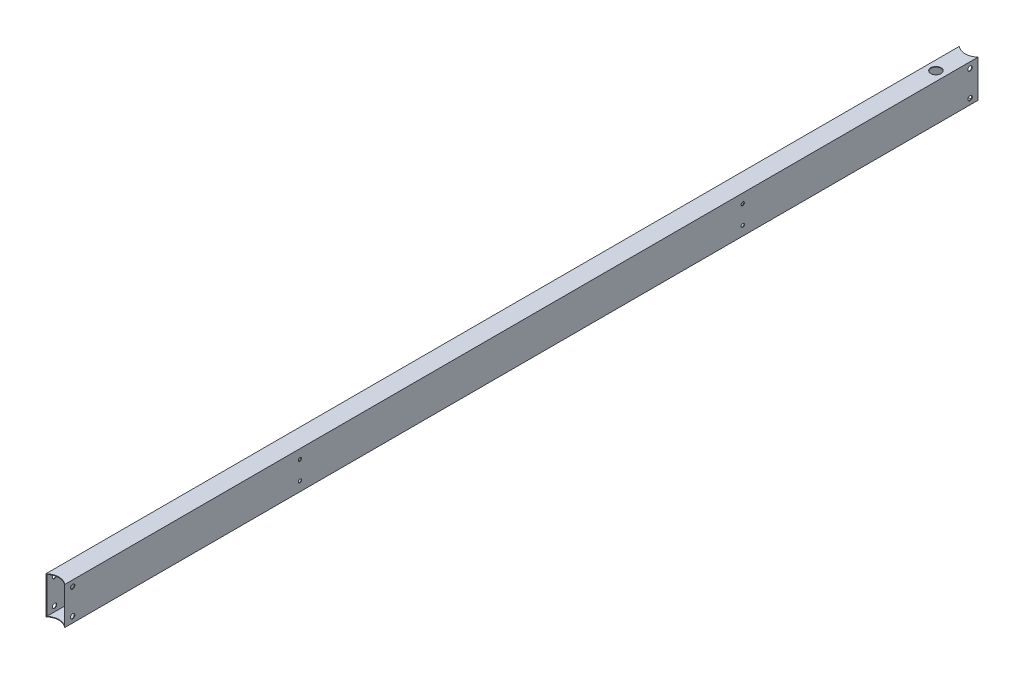
ISO-10303-21;
HEADER;
FILE_DESCRIPTION(('STEP AP214'),'2;1');
FILE_NAME('part.step','',(''),(''),'','','');
FILE_SCHEMA(('AUTOMOTIVE_DESIGN { 1 0 10303 214 1 1 1 1 }'));
ENDSEC;
DATA;
#1=APPLICATION_CONTEXT('core data for automotive mechanical design processes');
#2=APPLICATION_PROTOCOL_DEFINITION('international standard','automotive_design',2000,#1);
#3=PRODUCT_CONTEXT('',#1,'mechanical');
#4=PRODUCT('Part','Part','',(#3));
#5=PRODUCT_RELATED_PRODUCT_CATEGORY('part','',(#4));
#6=PRODUCT_DEFINITION_FORMATION('','',#4);
#7=PRODUCT_DEFINITION_CONTEXT('part definition',#1,'design');
#8=PRODUCT_DEFINITION('design','',#6,#7);
#9=PRODUCT_DEFINITION_SHAPE('','',#8);
#10=(LENGTH_UNIT() NAMED_UNIT(*) SI_UNIT(.MILLI.,.METRE.));
#11=(NAMED_UNIT(*) PLANE_ANGLE_UNIT() SI_UNIT($,.RADIAN.));
#12=(NAMED_UNIT(*) SI_UNIT($,.STERADIAN.) SOLID_ANGLE_UNIT());
#13=UNCERTAINTY_MEASURE_WITH_UNIT(LENGTH_MEASURE(1.E-05),#10,'distance_accuracy_value','');
#14=(GEOMETRIC_REPRESENTATION_CONTEXT(3) GLOBAL_UNCERTAINTY_ASSIGNED_CONTEXT((#13)) GLOBAL_UNIT_ASSIGNED_CONTEXT((#10,
#11,#12)) REPRESENTATION_CONTEXT('',''));
#15=CARTESIAN_POINT('',(0.,0.,0.));
#16=DIRECTION('',(0.,0.,1.));
#17=DIRECTION('',(1.,0.,0.));
#18=AXIS2_PLACEMENT_3D('',#15,#16,#17);
#19=CARTESIAN_POINT('',(0.,0.,1955.));
#20=DIRECTION('',(1.,0.,0.));
#21=DIRECTION('',(0.,0.,-1.));
#22=AXIS2_PLACEMENT_3D('',#19,#20,#21);
#23=PLANE('',#22);
#24=CARTESIAN_POINT('',(0.,19.9999999999997,1451.5));
#25=DIRECTION('',(1.,0.,0.));
#26=DIRECTION('',(0.,0.,-1.));
#27=AXIS2_PLACEMENT_3D('',#24,#25,#26);
#28=CIRCLE('',#27,3.49999999999997);
#29=CARTESIAN_POINT('',(0.,19.9999999999997,1448.));
#30=VERTEX_POINT('',#29);
#31=EDGE_CURVE('E174',#30,#30,#28,.T.);
#32=ORIENTED_EDGE('',*,*,#31,.T.);
#33=EDGE_LOOP('',(#32));
#34=FACE_BOUND('',#33,.T.);
#35=CARTESIAN_POINT('',(0.,59.9999999999998,503.5));
#36=DIRECTION('',(1.,0.,0.));
#37=DIRECTION('',(0.,0.,-1.));
#38=AXIS2_PLACEMENT_3D('',#35,#36,#37);
#39=CIRCLE('',#38,3.49999999999996);
#40=CARTESIAN_POINT('',(0.,59.9999999999998,500.));
#41=VERTEX_POINT('',#40);
#42=EDGE_CURVE('E313',#41,#41,#39,.T.);
#43=ORIENTED_EDGE('',*,*,#42,.T.);
#44=EDGE_LOOP('',(#43));
#45=FACE_BOUND('',#44,.T.);
#46=CARTESIAN_POINT('',(0.,19.9999999999998,503.5));
#47=DIRECTION('',(1.,0.,0.));
#48=DIRECTION('',(0.,0.,-1.));
#49=AXIS2_PLACEMENT_3D('',#46,#47,#48);
#50=CIRCLE('',#49,3.49999999999996);
#51=CARTESIAN_POINT('',(0.,19.9999999999998,500.));
#52=VERTEX_POINT('',#51);
#53=EDGE_CURVE('E317',#52,#52,#50,.T.);
#54=ORIENTED_EDGE('',*,*,#53,.T.);
#55=EDGE_LOOP('',(#54));
#56=FACE_BOUND('',#55,.T.);
#57=CARTESIAN_POINT('',(0.,59.9999999999997,1451.5));
#58=DIRECTION('',(1.,0.,0.));
#59=DIRECTION('',(0.,0.,-1.));
#60=AXIS2_PLACEMENT_3D('',#57,#58,#59);
#61=CIRCLE('',#60,3.49999999999997);
#62=CARTESIAN_POINT('',(0.,59.9999999999997,1448.));
#63=VERTEX_POINT('',#62);
#64=EDGE_CURVE('E170',#63,#63,#61,.T.);
#65=ORIENTED_EDGE('',*,*,#64,.T.);
#66=EDGE_LOOP('',(#65));
#67=FACE_BOUND('',#66,.T.);
#68=CARTESIAN_POINT('',(0.,12.4999999999999,17.));
#69=DIRECTION('',(1.,0.,0.));
#70=DIRECTION('',(0.,0.,-1.));
#71=AXIS2_PLACEMENT_3D('',#68,#69,#70);
#72=CIRCLE('',#71,4.75);
#73=CARTESIAN_POINT('',(0.,12.4999999999999,12.25));
#74=VERTEX_POINT('',#73);
#75=EDGE_CURVE('E157',#74,#74,#72,.T.);
#76=ORIENTED_EDGE('',*,*,#75,.T.);
#77=EDGE_LOOP('',(#76));
#78=FACE_BOUND('',#77,.T.);
#79=CARTESIAN_POINT('',(0.,67.4999999999999,1938.));
#80=DIRECTION('',(1.,0.,0.));
#81=DIRECTION('',(0.,0.,-1.));
#82=AXIS2_PLACEMENT_3D('',#79,#80,#81);
#83=CIRCLE('',#82,4.75000000000003);
#84=CARTESIAN_POINT('',(0.,67.4999999999999,1933.25));
#85=VERTEX_POINT('',#84);
#86=EDGE_CURVE('E206',#85,#85,#83,.T.);
#87=ORIENTED_EDGE('',*,*,#86,.T.);
#88=EDGE_LOOP('',(#87));
#89=FACE_BOUND('',#88,.T.);
#90=CARTESIAN_POINT('',(0.,12.4999999999999,1938.));
#91=DIRECTION('',(1.,0.,0.));
#92=DIRECTION('',(0.,0.,-1.));
#93=AXIS2_PLACEMENT_3D('',#90,#91,#92);
#94=CIRCLE('',#93,4.75000000000003);
#95=CARTESIAN_POINT('',(0.,12.4999999999999,1933.25));
#96=VERTEX_POINT('',#95);
#97=EDGE_CURVE('E212',#96,#96,#94,.T.);
#98=ORIENTED_EDGE('',*,*,#97,.T.);
#99=EDGE_LOOP('',(#98));
#100=FACE_BOUND('',#99,.T.);
#101=CARTESIAN_POINT('',(0.,67.4999999999999,17.));
#102=DIRECTION('',(1.,0.,0.));
#103=DIRECTION('',(0.,0.,-1.));
#104=AXIS2_PLACEMENT_3D('',#101,#102,#103);
#105=CIRCLE('',#104,4.75000000000001);
#106=CARTESIAN_POINT('',(0.,67.4999999999999,12.25));
#107=VERTEX_POINT('',#106);
#108=EDGE_CURVE('E152',#107,#107,#105,.T.);
#109=ORIENTED_EDGE('',*,*,#108,.T.);
#110=EDGE_LOOP('',(#109));
#111=FACE_BOUND('',#110,.T.);
#112=DIRECTION('',(0.,-1.,0.));
#113=VECTOR('',#112,1.);
#114=CARTESIAN_POINT('',(0.,0.,0.));
#115=LINE('',#114,#113);
#116=CARTESIAN_POINT('',(0.,80.0000000000001,0.));
#117=VERTEX_POINT('',#116);
#118=CARTESIAN_POINT('',(0.,0.,0.));
#119=VERTEX_POINT('',#118);
#120=EDGE_CURVE('E131',#117,#119,#115,.T.);
#121=ORIENTED_EDGE('',*,*,#120,.T.);
#122=DIRECTION('',(0.,0.,-1.));
#123=VECTOR('',#122,1.);
#124=CARTESIAN_POINT('',(0.,0.,1955.));
#125=LINE('',#124,#123);
#126=CARTESIAN_POINT('',(0.,0.,1955.));
#127=VERTEX_POINT('',#126);
#128=EDGE_CURVE('E126',#127,#119,#125,.T.);
#129=ORIENTED_EDGE('',*,*,#128,.F.);
#130=DIRECTION('',(0.,-1.,0.));
#131=VECTOR('',#130,1.);
#132=CARTESIAN_POINT('',(0.,0.,1955.));
#133=LINE('',#132,#131);
#134=CARTESIAN_POINT('',(0.,80.0000000000001,1955.));
#135=VERTEX_POINT('',#134);
#136=EDGE_CURVE('E105',#135,#127,#133,.T.);
#137=ORIENTED_EDGE('',*,*,#136,.F.);
#138=DIRECTION('',(0.,0.,-1.));
#139=VECTOR('',#138,1.);
#140=CARTESIAN_POINT('',(0.,80.0000000000001,1955.));
#141=LINE('',#140,#139);
#142=EDGE_CURVE('E117',#135,#117,#141,.T.);
#143=ORIENTED_EDGE('',*,*,#142,.T.);
#144=EDGE_LOOP('',(#121,#129,#137,#143));
#145=FACE_BOUND('',#144,.T.);
#146=ADVANCED_FACE('F35',(#34,#45,#56,#67,#78,#89,#100,#111,#145),#23,.F.);
#147=CARTESIAN_POINT('',(0.,0.,1955.));
#148=DIRECTION('',(0.,1.,0.));
#149=DIRECTION('',(0.,0.,1.));
#150=AXIS2_PLACEMENT_3D('',#147,#148,#149);
#151=PLANE('',#150);
#152=CARTESIAN_POINT('',(20.,0.,70.));
#153=DIRECTION('',(0.,1.,0.));
#154=DIRECTION('',(0.,0.,1.));
#155=AXIS2_PLACEMENT_3D('',#152,#153,#154);
#156=CIRCLE('',#155,11.);
#157=CARTESIAN_POINT('',(20.,0.,81.));
#158=VERTEX_POINT('',#157);
#159=EDGE_CURVE('E234',#158,#158,#156,.T.);
#160=ORIENTED_EDGE('',*,*,#159,.T.);
#161=EDGE_LOOP('',(#160));
#162=FACE_BOUND('',#161,.T.);
#163=DIRECTION('',(0.,0.,-1.));
#164=VECTOR('',#163,1.);
#165=CARTESIAN_POINT('',(40.,0.,1955.));
#166=LINE('',#165,#164);
#167=CARTESIAN_POINT('',(40.,0.,1955.));
#168=VERTEX_POINT('',#167);
#169=CARTESIAN_POINT('',(40.,0.,0.));
#170=VERTEX_POINT('',#169);
#171=EDGE_CURVE('E139',#168,#170,#166,.T.);
#172=ORIENTED_EDGE('',*,*,#171,.F.);
#173=CARTESIAN_POINT('',(20.,0.,1977.360679775));
#174=DIRECTION('',(0.,1.,0.));
#175=DIRECTION('',(0.,0.,1.));
#176=AXIS2_PLACEMENT_3D('',#173,#174,#175);
#177=CIRCLE('',#176,30.0000000000001);
#178=EDGE_CURVE('E242',#168,#127,#177,.T.);
#179=ORIENTED_EDGE('',*,*,#178,.T.);
#180=ORIENTED_EDGE('',*,*,#128,.T.);
#181=CARTESIAN_POINT('',(20.,0.,-22.3606797749979));
#182=DIRECTION('',(0.,1.,0.));
#183=DIRECTION('',(0.,0.,1.));
#184=AXIS2_PLACEMENT_3D('',#181,#182,#183);
#185=CIRCLE('',#184,30.);
#186=EDGE_CURVE('E253',#119,#170,#185,.T.);
#187=ORIENTED_EDGE('',*,*,#186,.T.);
#188=EDGE_LOOP('',(#172,#179,#180,#187));
#189=FACE_BOUND('',#188,.T.);
#190=ADVANCED_FACE('F287',(#162,#189),#151,.F.);
#191=CARTESIAN_POINT('',(40.,0.,1955.));
#192=DIRECTION('',(-1.,0.,0.));
#193=DIRECTION('',(0.,0.,1.));
#194=AXIS2_PLACEMENT_3D('',#191,#192,#193);
#195=PLANE('',#194);
#196=CARTESIAN_POINT('',(40.,19.9999999999997,1451.5));
#197=DIRECTION('',(1.,0.,0.));
#198=DIRECTION('',(0.,0.,-1.));
#199=AXIS2_PLACEMENT_3D('',#196,#197,#198);
#200=CIRCLE('',#199,3.49999999999997);
#201=CARTESIAN_POINT('',(40.,19.9999999999997,1448.));
#202=VERTEX_POINT('',#201);
#203=EDGE_CURVE('E527',#202,#202,#200,.T.);
#204=ORIENTED_EDGE('',*,*,#203,.F.);
#205=EDGE_LOOP('',(#204));
#206=FACE_BOUND('',#205,.T.);
#207=CARTESIAN_POINT('',(40.,59.9999999999998,503.5));
#208=DIRECTION('',(1.,0.,0.));
#209=DIRECTION('',(0.,0.,-1.));
#210=AXIS2_PLACEMENT_3D('',#207,#208,#209);
#211=CIRCLE('',#210,3.49999999999996);
#212=CARTESIAN_POINT('',(40.,59.9999999999998,500.));
#213=VERTEX_POINT('',#212);
#214=EDGE_CURVE('E533',#213,#213,#211,.T.);
#215=ORIENTED_EDGE('',*,*,#214,.F.);
#216=EDGE_LOOP('',(#215));
#217=FACE_BOUND('',#216,.T.);
#218=CARTESIAN_POINT('',(40.,19.9999999999998,503.5));
#219=DIRECTION('',(1.,0.,0.));
#220=DIRECTION('',(0.,0.,-1.));
#221=AXIS2_PLACEMENT_3D('',#218,#219,#220);
#222=CIRCLE('',#221,3.49999999999996);
#223=CARTESIAN_POINT('',(40.,19.9999999999998,500.));
#224=VERTEX_POINT('',#223);
#225=EDGE_CURVE('E187',#224,#224,#222,.T.);
#226=ORIENTED_EDGE('',*,*,#225,.F.);
#227=EDGE_LOOP('',(#226));
#228=FACE_BOUND('',#227,.T.);
#229=CARTESIAN_POINT('',(40.,59.9999999999997,1451.5));
#230=DIRECTION('',(1.,0.,0.));
#231=DIRECTION('',(0.,0.,-1.));
#232=AXIS2_PLACEMENT_3D('',#229,#230,#231);
#233=CIRCLE('',#232,3.49999999999997);
#234=CARTESIAN_POINT('',(40.,59.9999999999997,1448.));
#235=VERTEX_POINT('',#234);
#236=EDGE_CURVE('E193',#235,#235,#233,.T.);
#237=ORIENTED_EDGE('',*,*,#236,.F.);
#238=EDGE_LOOP('',(#237));
#239=FACE_BOUND('',#238,.T.);
#240=CARTESIAN_POINT('',(40.,12.4999999999999,17.));
#241=DIRECTION('',(1.,0.,0.));
#242=DIRECTION('',(0.,0.,-1.));
#243=AXIS2_PLACEMENT_3D('',#240,#241,#242);
#244=CIRCLE('',#243,4.75);
#245=CARTESIAN_POINT('',(40.,12.4999999999999,12.25));
#246=VERTEX_POINT('',#245);
#247=EDGE_CURVE('E203',#246,#246,#244,.T.);
#248=ORIENTED_EDGE('',*,*,#247,.F.);
#249=EDGE_LOOP('',(#248));
#250=FACE_BOUND('',#249,.T.);
#251=CARTESIAN_POINT('',(40.,67.4999999999999,1938.));
#252=DIRECTION('',(1.,0.,0.));
#253=DIRECTION('',(0.,0.,-1.));
#254=AXIS2_PLACEMENT_3D('',#251,#252,#253);
#255=CIRCLE('',#254,4.75000000000003);
#256=CARTESIAN_POINT('',(40.,67.4999999999999,1933.25));
#257=VERTEX_POINT('',#256);
#258=EDGE_CURVE('E209',#257,#257,#255,.T.);
#259=ORIENTED_EDGE('',*,*,#258,.F.);
#260=EDGE_LOOP('',(#259));
#261=FACE_BOUND('',#260,.T.);
#262=CARTESIAN_POINT('',(40.,12.4999999999999,1938.));
#263=DIRECTION('',(1.,0.,0.));
#264=DIRECTION('',(0.,0.,-1.));
#265=AXIS2_PLACEMENT_3D('',#262,#263,#264);
#266=CIRCLE('',#265,4.75000000000003);
#267=CARTESIAN_POINT('',(40.,12.4999999999999,1933.25));
#268=VERTEX_POINT('',#267);
#269=EDGE_CURVE('E200',#268,#268,#266,.T.);
#270=ORIENTED_EDGE('',*,*,#269,.F.);
#271=EDGE_LOOP('',(#270));
#272=FACE_BOUND('',#271,.T.);
#273=CARTESIAN_POINT('',(40.,67.4999999999999,17.));
#274=DIRECTION('',(1.,0.,0.));
#275=DIRECTION('',(0.,0.,-1.));
#276=AXIS2_PLACEMENT_3D('',#273,#274,#275);
#277=CIRCLE('',#276,4.75000000000001);
#278=CARTESIAN_POINT('',(40.,67.4999999999999,12.25));
#279=VERTEX_POINT('',#278);
#280=EDGE_CURVE('E223',#279,#279,#277,.T.);
#281=ORIENTED_EDGE('',*,*,#280,.F.);
#282=EDGE_LOOP('',(#281));
#283=FACE_BOUND('',#282,.T.);
#284=DIRECTION('',(0.,1.,0.));
#285=VECTOR('',#284,1.);
#286=CARTESIAN_POINT('',(40.,0.,0.));
#287=LINE('',#286,#285);
#288=CARTESIAN_POINT('',(40.,80.0000000000001,0.));
#289=VERTEX_POINT('',#288);
#290=EDGE_CURVE('E127',#170,#289,#287,.T.);
#291=ORIENTED_EDGE('',*,*,#290,.T.);
#292=DIRECTION('',(0.,0.,-1.));
#293=VECTOR('',#292,1.);
#294=CARTESIAN_POINT('',(40.,80.0000000000001,1955.));
#295=LINE('',#294,#293);
#296=CARTESIAN_POINT('',(40.,80.0000000000001,1955.));
#297=VERTEX_POINT('',#296);
#298=EDGE_CURVE('E122',#297,#289,#295,.T.);
#299=ORIENTED_EDGE('',*,*,#298,.F.);
#300=DIRECTION('',(0.,1.,0.));
#301=VECTOR('',#300,1.);
#302=CARTESIAN_POINT('',(40.,0.,1955.));
#303=LINE('',#302,#301);
#304=EDGE_CURVE('E108',#168,#297,#303,.T.);
#305=ORIENTED_EDGE('',*,*,#304,.F.);
#306=ORIENTED_EDGE('',*,*,#171,.T.);
#307=EDGE_LOOP('',(#291,#299,#305,#306));
#308=FACE_BOUND('',#307,.T.);
#309=ADVANCED_FACE('F290',(#206,#217,#228,#239,#250,#261,#272,#283,#308),#195,.F.);
#310=CARTESIAN_POINT('',(0.,80.0000000000001,1955.));
#311=DIRECTION('',(0.,-1.,0.));
#312=DIRECTION('',(0.,0.,-1.));
#313=AXIS2_PLACEMENT_3D('',#310,#311,#312);
#314=PLANE('',#313);
#315=CARTESIAN_POINT('',(20.,80.0000000000001,70.));
#316=DIRECTION('',(0.,1.,0.));
#317=DIRECTION('',(0.,0.,1.));
#318=AXIS2_PLACEMENT_3D('',#315,#316,#317);
#319=CIRCLE('',#318,11.);
#320=CARTESIAN_POINT('',(20.,80.0000000000001,81.));
#321=VERTEX_POINT('',#320);
#322=EDGE_CURVE('E113',#321,#321,#319,.T.);
#323=ORIENTED_EDGE('',*,*,#322,.F.);
#324=EDGE_LOOP('',(#323));
#325=FACE_BOUND('',#324,.T.);
#326=ORIENTED_EDGE('',*,*,#142,.F.);
#327=CARTESIAN_POINT('',(20.,80.0000000000001,1977.360679775));
#328=DIRECTION('',(0.,1.,0.));
#329=DIRECTION('',(0.,0.,-1.));
#330=AXIS2_PLACEMENT_3D('',#327,#328,#329);
#331=CIRCLE('',#330,30.0000000000001);
#332=EDGE_CURVE('E101',#297,#135,#331,.T.);
#333=ORIENTED_EDGE('',*,*,#332,.F.);
#334=ORIENTED_EDGE('',*,*,#298,.T.);
#335=CARTESIAN_POINT('',(20.,80.0000000000001,-22.3606797749979));
#336=DIRECTION('',(0.,1.,0.));
#337=DIRECTION('',(0.,0.,1.));
#338=AXIS2_PLACEMENT_3D('',#335,#336,#337);
#339=CIRCLE('',#338,30.);
#340=EDGE_CURVE('E119',#117,#289,#339,.T.);
#341=ORIENTED_EDGE('',*,*,#340,.F.);
#342=EDGE_LOOP('',(#326,#333,#334,#341));
#343=FACE_BOUND('',#342,.T.);
#344=ADVANCED_FACE('F118',(#325,#343),#314,.F.);
#345=CARTESIAN_POINT('',(1.2,1.2,1955.));
#346=DIRECTION('',(1.,0.,0.));
#347=DIRECTION('',(0.,0.,-1.));
#348=AXIS2_PLACEMENT_3D('',#345,#346,#347);
#349=PLANE('',#348);
#350=CARTESIAN_POINT('',(1.2,19.9999999999997,1451.5));
#351=DIRECTION('',(1.,0.,0.));
#352=DIRECTION('',(0.,0.,-1.));
#353=AXIS2_PLACEMENT_3D('',#350,#351,#352);
#354=CIRCLE('',#353,3.49999999999997);
#355=CARTESIAN_POINT('',(1.2,19.9999999999997,1448.));
#356=VERTEX_POINT('',#355);
#357=EDGE_CURVE('E190',#356,#356,#354,.T.);
#358=ORIENTED_EDGE('',*,*,#357,.F.);
#359=EDGE_LOOP('',(#358));
#360=FACE_BOUND('',#359,.T.);
#361=CARTESIAN_POINT('',(1.2,59.9999999999998,503.5));
#362=DIRECTION('',(1.,0.,0.));
#363=DIRECTION('',(0.,0.,-1.));
#364=AXIS2_PLACEMENT_3D('',#361,#362,#363);
#365=CIRCLE('',#364,3.49999999999996);
#366=CARTESIAN_POINT('',(1.2,59.9999999999998,500.));
#367=VERTEX_POINT('',#366);
#368=EDGE_CURVE('E177',#367,#367,#365,.T.);
#369=ORIENTED_EDGE('',*,*,#368,.F.);
#370=EDGE_LOOP('',(#369));
#371=FACE_BOUND('',#370,.T.);
#372=CARTESIAN_POINT('',(1.2,19.9999999999998,503.5));
#373=DIRECTION('',(1.,0.,0.));
#374=DIRECTION('',(0.,0.,-1.));
#375=AXIS2_PLACEMENT_3D('',#372,#373,#374);
#376=CIRCLE('',#375,3.49999999999996);
#377=CARTESIAN_POINT('',(1.2,19.9999999999998,500.));
#378=VERTEX_POINT('',#377);
#379=EDGE_CURVE('E173',#378,#378,#376,.T.);
#380=ORIENTED_EDGE('',*,*,#379,.F.);
#381=EDGE_LOOP('',(#380));
#382=FACE_BOUND('',#381,.T.);
#383=CARTESIAN_POINT('',(1.2,59.9999999999997,1451.5));
#384=DIRECTION('',(1.,0.,0.));
#385=DIRECTION('',(0.,0.,-1.));
#386=AXIS2_PLACEMENT_3D('',#383,#384,#385);
#387=CIRCLE('',#386,3.49999999999997);
#388=CARTESIAN_POINT('',(1.2,59.9999999999997,1448.));
#389=VERTEX_POINT('',#388);
#390=EDGE_CURVE('E169',#389,#389,#387,.T.);
#391=ORIENTED_EDGE('',*,*,#390,.F.);
#392=EDGE_LOOP('',(#391));
#393=FACE_BOUND('',#392,.T.);
#394=CARTESIAN_POINT('',(1.2,12.4999999999999,17.));
#395=DIRECTION('',(1.,0.,0.));
#396=DIRECTION('',(0.,0.,-1.));
#397=AXIS2_PLACEMENT_3D('',#394,#395,#396);
#398=CIRCLE('',#397,4.75);
#399=CARTESIAN_POINT('',(1.2,12.4999999999999,12.25));
#400=VERTEX_POINT('',#399);
#401=EDGE_CURVE('E165',#400,#400,#398,.T.);
#402=ORIENTED_EDGE('',*,*,#401,.F.);
#403=EDGE_LOOP('',(#402));
#404=FACE_BOUND('',#403,.T.);
#405=CARTESIAN_POINT('',(1.2,67.4999999999999,1938.));
#406=DIRECTION('',(1.,0.,0.));
#407=DIRECTION('',(0.,0.,-1.));
#408=AXIS2_PLACEMENT_3D('',#405,#406,#407);
#409=CIRCLE('',#408,4.75000000000003);
#410=CARTESIAN_POINT('',(1.2,67.4999999999999,1933.25));
#411=VERTEX_POINT('',#410);
#412=EDGE_CURVE('E161',#411,#411,#409,.T.);
#413=ORIENTED_EDGE('',*,*,#412,.F.);
#414=EDGE_LOOP('',(#413));
#415=FACE_BOUND('',#414,.T.);
#416=CARTESIAN_POINT('',(1.2,12.4999999999999,1938.));
#417=DIRECTION('',(1.,0.,0.));
#418=DIRECTION('',(0.,0.,-1.));
#419=AXIS2_PLACEMENT_3D('',#416,#417,#418);
#420=CIRCLE('',#419,4.75000000000003);
#421=CARTESIAN_POINT('',(1.2,12.4999999999999,1933.25));
#422=VERTEX_POINT('',#421);
#423=EDGE_CURVE('E156',#422,#422,#420,.T.);
#424=ORIENTED_EDGE('',*,*,#423,.F.);
#425=EDGE_LOOP('',(#424));
#426=FACE_BOUND('',#425,.T.);
#427=CARTESIAN_POINT('',(1.2,67.4999999999999,17.));
#428=DIRECTION('',(1.,0.,0.));
#429=DIRECTION('',(0.,0.,-1.));
#430=AXIS2_PLACEMENT_3D('',#427,#428,#429);
#431=CIRCLE('',#430,4.75000000000001);
#432=CARTESIAN_POINT('',(1.2,67.4999999999999,12.25));
#433=VERTEX_POINT('',#432);
#434=EDGE_CURVE('E151',#433,#433,#431,.T.);
#435=ORIENTED_EDGE('',*,*,#434,.F.);
#436=EDGE_LOOP('',(#435));
#437=FACE_BOUND('',#436,.T.);
#438=DIRECTION('',(0.,1.,0.));
#439=VECTOR('',#438,1.);
#440=CARTESIAN_POINT('',(1.2,-1875.,1953.98205706107));
#441=LINE('',#440,#439);
#442=CARTESIAN_POINT('',(1.2,1.20000000000009,1953.98205706107));
#443=VERTEX_POINT('',#442);
#444=CARTESIAN_POINT('',(1.2,78.8,1953.98205706107));
#445=VERTEX_POINT('',#444);
#446=EDGE_CURVE('E50',#443,#445,#441,.T.);
#447=ORIENTED_EDGE('',*,*,#446,.F.);
#448=DIRECTION('',(0.,0.,-1.));
#449=VECTOR('',#448,1.);
#450=CARTESIAN_POINT('',(1.2,1.2,1955.));
#451=LINE('',#450,#449);
#452=CARTESIAN_POINT('',(1.2,1.20000000000009,1.01794293892603));
#453=VERTEX_POINT('',#452);
#454=EDGE_CURVE('E134',#443,#453,#451,.T.);
#455=ORIENTED_EDGE('',*,*,#454,.T.);
#456=DIRECTION('',(0.,1.,0.));
#457=VECTOR('',#456,1.);
#458=CARTESIAN_POINT('',(1.2,-1875.,1.01794293892603));
#459=LINE('',#458,#457);
#460=CARTESIAN_POINT('',(1.2,78.8,1.01794293892603));
#461=VERTEX_POINT('',#460);
#462=EDGE_CURVE('E250',#461,#453,#459,.F.);
#463=ORIENTED_EDGE('',*,*,#462,.F.);
#464=DIRECTION('',(0.,0.,-1.));
#465=VECTOR('',#464,1.);
#466=CARTESIAN_POINT('',(1.2,78.8000000000001,1955.));
#467=LINE('',#466,#465);
#468=EDGE_CURVE('E256',#445,#461,#467,.T.);
#469=ORIENTED_EDGE('',*,*,#468,.F.);
#470=EDGE_LOOP('',(#447,#455,#463,#469));
#471=FACE_BOUND('',#470,.T.);
#472=ADVANCED_FACE('F266',(#360,#371,#382,#393,#404,#415,#426,#437,#471),#349,.T.);
#473=CARTESIAN_POINT('',(1.2,1.2,1955.));
#474=DIRECTION('',(0.,1.,0.));
#475=DIRECTION('',(0.,0.,1.));
#476=AXIS2_PLACEMENT_3D('',#473,#474,#475);
#477=PLANE('',#476);
#478=CARTESIAN_POINT('',(20.,1.20000000000009,1977.360679775));
#479=DIRECTION('',(0.,1.,0.));
#480=DIRECTION('',(0.,0.,1.));
#481=AXIS2_PLACEMENT_3D('',#478,#479,#480);
#482=CIRCLE('',#481,30.0000000000001);
#483=CARTESIAN_POINT('',(38.8,1.19999999999987,1953.98205706107));
#484=VERTEX_POINT('',#483);
#485=EDGE_CURVE('E239',#484,#443,#482,.T.);
#486=ORIENTED_EDGE('',*,*,#485,.F.);
#487=DIRECTION('',(0.,0.,-1.));
#488=VECTOR('',#487,1.);
#489=CARTESIAN_POINT('',(38.8,1.2,1955.));
#490=LINE('',#489,#488);
#491=CARTESIAN_POINT('',(38.8,1.19999999999987,1.01794293892603));
#492=VERTEX_POINT('',#491);
#493=EDGE_CURVE('E258',#484,#492,#490,.T.);
#494=ORIENTED_EDGE('',*,*,#493,.T.);
#495=CARTESIAN_POINT('',(20.,1.20000000000009,-22.3606797749979));
#496=DIRECTION('',(0.,1.,0.));
#497=DIRECTION('',(0.,0.,1.));
#498=AXIS2_PLACEMENT_3D('',#495,#496,#497);
#499=CIRCLE('',#498,30.);
#500=EDGE_CURVE('E247',#453,#492,#499,.T.);
#501=ORIENTED_EDGE('',*,*,#500,.F.);
#502=ORIENTED_EDGE('',*,*,#454,.F.);
#503=EDGE_LOOP('',(#486,#494,#501,#502));
#504=FACE_BOUND('',#503,.T.);
#505=CARTESIAN_POINT('',(20.,1.20000000000009,70.));
#506=DIRECTION('',(0.,1.,0.));
#507=DIRECTION('',(0.,0.,1.));
#508=AXIS2_PLACEMENT_3D('',#505,#506,#507);
#509=CIRCLE('',#508,11.);
#510=CARTESIAN_POINT('',(20.,1.20000000000009,81.));
#511=VERTEX_POINT('',#510);
#512=EDGE_CURVE('E146',#511,#511,#509,.T.);
#513=ORIENTED_EDGE('',*,*,#512,.F.);
#514=EDGE_LOOP('',(#513));
#515=FACE_BOUND('',#514,.T.);
#516=ADVANCED_FACE('F272',(#504,#515),#477,.T.);
#517=CARTESIAN_POINT('',(38.8,1.2,1955.));
#518=DIRECTION('',(-1.,0.,0.));
#519=DIRECTION('',(0.,0.,1.));
#520=AXIS2_PLACEMENT_3D('',#517,#518,#519);
#521=PLANE('',#520);
#522=CARTESIAN_POINT('',(38.8,19.9999999999997,1451.5));
#523=DIRECTION('',(-1.,0.,0.));
#524=DIRECTION('',(0.,0.,1.));
#525=AXIS2_PLACEMENT_3D('',#522,#523,#524);
#526=CIRCLE('',#525,3.49999999999997);
#527=CARTESIAN_POINT('',(38.8,19.9999999999997,1455.));
#528=VERTEX_POINT('',#527);
#529=EDGE_CURVE('E38',#528,#528,#526,.T.);
#530=ORIENTED_EDGE('',*,*,#529,.F.);
#531=EDGE_LOOP('',(#530));
#532=FACE_BOUND('',#531,.T.);
#533=CARTESIAN_POINT('',(38.8,59.9999999999998,503.5));
#534=DIRECTION('',(-1.,0.,0.));
#535=DIRECTION('',(0.,0.,1.));
#536=AXIS2_PLACEMENT_3D('',#533,#534,#535);
#537=CIRCLE('',#536,3.49999999999996);
#538=CARTESIAN_POINT('',(38.8,59.9999999999998,507.));
#539=VERTEX_POINT('',#538);
#540=EDGE_CURVE('E175',#539,#539,#537,.T.);
#541=ORIENTED_EDGE('',*,*,#540,.F.);
#542=EDGE_LOOP('',(#541));
#543=FACE_BOUND('',#542,.T.);
#544=CARTESIAN_POINT('',(38.8,19.9999999999998,503.5));
#545=DIRECTION('',(-1.,0.,0.));
#546=DIRECTION('',(0.,0.,1.));
#547=AXIS2_PLACEMENT_3D('',#544,#545,#546);
#548=CIRCLE('',#547,3.49999999999996);
#549=CARTESIAN_POINT('',(38.8,19.9999999999998,507.));
#550=VERTEX_POINT('',#549);
#551=EDGE_CURVE('E171',#550,#550,#548,.T.);
#552=ORIENTED_EDGE('',*,*,#551,.F.);
#553=EDGE_LOOP('',(#552));
#554=FACE_BOUND('',#553,.T.);
#555=CARTESIAN_POINT('',(38.8,59.9999999999997,1451.5));
#556=DIRECTION('',(-1.,0.,0.));
#557=DIRECTION('',(0.,0.,1.));
#558=AXIS2_PLACEMENT_3D('',#555,#556,#557);
#559=CIRCLE('',#558,3.49999999999997);
#560=CARTESIAN_POINT('',(38.8,59.9999999999997,1455.));
#561=VERTEX_POINT('',#560);
#562=EDGE_CURVE('E166',#561,#561,#559,.T.);
#563=ORIENTED_EDGE('',*,*,#562,.F.);
#564=EDGE_LOOP('',(#563));
#565=FACE_BOUND('',#564,.T.);
#566=CARTESIAN_POINT('',(38.8,12.4999999999999,17.));
#567=DIRECTION('',(-1.,0.,0.));
#568=DIRECTION('',(0.,0.,1.));
#569=AXIS2_PLACEMENT_3D('',#566,#567,#568);
#570=CIRCLE('',#569,4.75);
#571=CARTESIAN_POINT('',(38.8,12.4999999999999,21.75));
#572=VERTEX_POINT('',#571);
#573=EDGE_CURVE('E162',#572,#572,#570,.T.);
#574=ORIENTED_EDGE('',*,*,#573,.F.);
#575=EDGE_LOOP('',(#574));
#576=FACE_BOUND('',#575,.T.);
#577=CARTESIAN_POINT('',(38.8,67.4999999999999,1938.));
#578=DIRECTION('',(-1.,0.,0.));
#579=DIRECTION('',(0.,0.,1.));
#580=AXIS2_PLACEMENT_3D('',#577,#578,#579);
#581=CIRCLE('',#580,4.75000000000003);
#582=CARTESIAN_POINT('',(38.8,67.4999999999999,1942.75));
#583=VERTEX_POINT('',#582);
#584=EDGE_CURVE('E158',#583,#583,#581,.T.);
#585=ORIENTED_EDGE('',*,*,#584,.F.);
#586=EDGE_LOOP('',(#585));
#587=FACE_BOUND('',#586,.T.);
#588=CARTESIAN_POINT('',(38.8,12.4999999999999,1938.));
#589=DIRECTION('',(-1.,0.,0.));
#590=DIRECTION('',(0.,0.,1.));
#591=AXIS2_PLACEMENT_3D('',#588,#589,#590);
#592=CIRCLE('',#591,4.75000000000003);
#593=CARTESIAN_POINT('',(38.8,12.4999999999999,1942.75));
#594=VERTEX_POINT('',#593);
#595=EDGE_CURVE('E153',#594,#594,#592,.T.);
#596=ORIENTED_EDGE('',*,*,#595,.F.);
#597=EDGE_LOOP('',(#596));
#598=FACE_BOUND('',#597,.T.);
#599=CARTESIAN_POINT('',(38.8,67.4999999999999,17.));
#600=DIRECTION('',(-1.,0.,0.));
#601=DIRECTION('',(0.,0.,1.));
#602=AXIS2_PLACEMENT_3D('',#599,#600,#601);
#603=CIRCLE('',#602,4.75000000000001);
#604=CARTESIAN_POINT('',(38.8,67.4999999999999,21.75));
#605=VERTEX_POINT('',#604);
#606=EDGE_CURVE('E148',#605,#605,#603,.T.);
#607=ORIENTED_EDGE('',*,*,#606,.F.);
#608=EDGE_LOOP('',(#607));
#609=FACE_BOUND('',#608,.T.);
#610=DIRECTION('',(0.,1.,0.));
#611=VECTOR('',#610,1.);
#612=CARTESIAN_POINT('',(38.8,-1875.,1953.98205706107));
#613=LINE('',#612,#611);
#614=CARTESIAN_POINT('',(38.8,78.8,1953.98205706107));
#615=VERTEX_POINT('',#614);
#616=EDGE_CURVE('E237',#615,#484,#613,.F.);
#617=ORIENTED_EDGE('',*,*,#616,.F.);
#618=DIRECTION('',(0.,0.,-1.));
#619=VECTOR('',#618,1.);
#620=CARTESIAN_POINT('',(38.8,78.8000000000001,1955.));
#621=LINE('',#620,#619);
#622=CARTESIAN_POINT('',(38.8,78.8,1.01794293892603));
#623=VERTEX_POINT('',#622);
#624=EDGE_CURVE('E58',#615,#623,#621,.T.);
#625=ORIENTED_EDGE('',*,*,#624,.T.);
#626=DIRECTION('',(0.,1.,0.));
#627=VECTOR('',#626,1.);
#628=CARTESIAN_POINT('',(38.8,-1875.,1.01794293892603));
#629=LINE('',#628,#627);
#630=EDGE_CURVE('E245',#492,#623,#629,.T.);
#631=ORIENTED_EDGE('',*,*,#630,.F.);
#632=ORIENTED_EDGE('',*,*,#493,.F.);
#633=EDGE_LOOP('',(#617,#625,#631,#632));
#634=FACE_BOUND('',#633,.T.);
#635=ADVANCED_FACE('F275',(#532,#543,#554,#565,#576,#587,#598,#609,#634),#521,.T.);
#636=CARTESIAN_POINT('',(1.2,78.8000000000001,1955.));
#637=DIRECTION('',(0.,-1.,0.));
#638=DIRECTION('',(0.,0.,-1.));
#639=AXIS2_PLACEMENT_3D('',#636,#637,#638);
#640=PLANE('',#639);
#641=CARTESIAN_POINT('',(20.,78.8,1977.360679775));
#642=DIRECTION('',(0.,-1.,0.));
#643=DIRECTION('',(0.,0.,-1.));
#644=AXIS2_PLACEMENT_3D('',#641,#642,#643);
#645=CIRCLE('',#644,30.0000000000001);
#646=EDGE_CURVE('E11',#445,#615,#645,.T.);
#647=ORIENTED_EDGE('',*,*,#646,.F.);
#648=ORIENTED_EDGE('',*,*,#468,.T.);
#649=CARTESIAN_POINT('',(20.,78.8,-22.3606797749979));
#650=DIRECTION('',(0.,-1.,0.));
#651=DIRECTION('',(0.,0.,-1.));
#652=AXIS2_PLACEMENT_3D('',#649,#650,#651);
#653=CIRCLE('',#652,30.);
#654=EDGE_CURVE('E43',#623,#461,#653,.T.);
#655=ORIENTED_EDGE('',*,*,#654,.F.);
#656=ORIENTED_EDGE('',*,*,#624,.F.);
#657=EDGE_LOOP('',(#647,#648,#655,#656));
#658=FACE_BOUND('',#657,.T.);
#659=CARTESIAN_POINT('',(20.,78.8,70.));
#660=DIRECTION('',(0.,-1.,0.));
#661=DIRECTION('',(0.,0.,-1.));
#662=AXIS2_PLACEMENT_3D('',#659,#660,#661);
#663=CIRCLE('',#662,11.);
#664=CARTESIAN_POINT('',(20.,78.8,59.));
#665=VERTEX_POINT('',#664);
#666=EDGE_CURVE('E112',#665,#665,#663,.T.);
#667=ORIENTED_EDGE('',*,*,#666,.F.);
#668=EDGE_LOOP('',(#667));
#669=FACE_BOUND('',#668,.T.);
#670=ADVANCED_FACE('F294',(#658,#669),#640,.T.);
#671=CARTESIAN_POINT('',(20.,-1875.,-22.3606797749979));
#672=DIRECTION('',(0.,1.,0.));
#673=DIRECTION('',(0.,0.,1.));
#674=AXIS2_PLACEMENT_3D('',#671,#672,#673);
#675=CYLINDRICAL_SURFACE('',#674,30.);
#676=ORIENTED_EDGE('',*,*,#462,.T.);
#677=ORIENTED_EDGE('',*,*,#500,.T.);
#678=ORIENTED_EDGE('',*,*,#630,.T.);
#679=ORIENTED_EDGE('',*,*,#654,.T.);
#680=EDGE_LOOP('',(#676,#677,#678,#679));
#681=FACE_BOUND('',#680,.T.);
#682=ORIENTED_EDGE('',*,*,#120,.F.);
#683=ORIENTED_EDGE('',*,*,#340,.T.);
#684=ORIENTED_EDGE('',*,*,#290,.F.);
#685=ORIENTED_EDGE('',*,*,#186,.F.);
#686=EDGE_LOOP('',(#682,#683,#684,#685));
#687=FACE_BOUND('',#686,.T.);
#688=ADVANCED_FACE('F269',(#681,#687),#675,.F.);
#689=CARTESIAN_POINT('',(20.,-1875.,70.));
#690=DIRECTION('',(0.,1.,0.));
#691=DIRECTION('',(0.,0.,1.));
#692=AXIS2_PLACEMENT_3D('',#689,#690,#691);
#693=CYLINDRICAL_SURFACE('',#692,11.);
#694=ORIENTED_EDGE('',*,*,#666,.T.);
#695=EDGE_LOOP('',(#694));
#696=FACE_BOUND('',#695,.T.);
#697=ORIENTED_EDGE('',*,*,#322,.T.);
#698=EDGE_LOOP('',(#697));
#699=FACE_BOUND('',#698,.T.);
#700=ADVANCED_FACE('F284',(#696,#699),#693,.F.);
#701=CARTESIAN_POINT('',(20.,-1875.,1977.360679775));
#702=DIRECTION('',(0.,1.,0.));
#703=DIRECTION('',(0.,0.,1.));
#704=AXIS2_PLACEMENT_3D('',#701,#702,#703);
#705=CYLINDRICAL_SURFACE('',#704,30.0000000000001);
#706=ORIENTED_EDGE('',*,*,#446,.T.);
#707=ORIENTED_EDGE('',*,*,#646,.T.);
#708=ORIENTED_EDGE('',*,*,#616,.T.);
#709=ORIENTED_EDGE('',*,*,#485,.T.);
#710=EDGE_LOOP('',(#706,#707,#708,#709));
#711=FACE_BOUND('',#710,.T.);
#712=ORIENTED_EDGE('',*,*,#304,.T.);
#713=ORIENTED_EDGE('',*,*,#332,.T.);
#714=ORIENTED_EDGE('',*,*,#136,.T.);
#715=ORIENTED_EDGE('',*,*,#178,.F.);
#716=EDGE_LOOP('',(#712,#713,#714,#715));
#717=FACE_BOUND('',#716,.T.);
#718=ADVANCED_FACE('F103',(#711,#717),#705,.F.);
#719=ORIENTED_EDGE('',*,*,#512,.T.);
#720=EDGE_LOOP('',(#719));
#721=FACE_BOUND('',#720,.T.);
#722=ORIENTED_EDGE('',*,*,#159,.F.);
#723=EDGE_LOOP('',(#722));
#724=FACE_BOUND('',#723,.T.);
#725=ADVANCED_FACE('F279',(#721,#724),#693,.F.);
#726=CARTESIAN_POINT('',(0.,67.4999999999999,17.));
#727=DIRECTION('',(1.,0.,0.));
#728=DIRECTION('',(0.,0.,-1.));
#729=AXIS2_PLACEMENT_3D('',#726,#727,#728);
#730=CYLINDRICAL_SURFACE('',#729,4.75000000000001);
#731=ORIENTED_EDGE('',*,*,#606,.T.);
#732=EDGE_LOOP('',(#731));
#733=FACE_BOUND('',#732,.T.);
#734=ORIENTED_EDGE('',*,*,#280,.T.);
#735=EDGE_LOOP('',(#734));
#736=FACE_BOUND('',#735,.T.);
#737=ADVANCED_FACE('F282',(#733,#736),#730,.F.);
#738=ORIENTED_EDGE('',*,*,#434,.T.);
#739=EDGE_LOOP('',(#738));
#740=FACE_BOUND('',#739,.T.);
#741=ORIENTED_EDGE('',*,*,#108,.F.);
#742=EDGE_LOOP('',(#741));
#743=FACE_BOUND('',#742,.T.);
#744=ADVANCED_FACE('F328',(#740,#743),#730,.F.);
#745=CARTESIAN_POINT('',(0.,12.4999999999999,1938.));
#746=DIRECTION('',(1.,0.,0.));
#747=DIRECTION('',(0.,0.,-1.));
#748=AXIS2_PLACEMENT_3D('',#745,#746,#747);
#749=CYLINDRICAL_SURFACE('',#748,4.75000000000003);
#750=ORIENTED_EDGE('',*,*,#595,.T.);
#751=EDGE_LOOP('',(#750));
#752=FACE_BOUND('',#751,.T.);
#753=ORIENTED_EDGE('',*,*,#269,.T.);
#754=EDGE_LOOP('',(#753));
#755=FACE_BOUND('',#754,.T.);
#756=ADVANCED_FACE('F330',(#752,#755),#749,.F.);
#757=CARTESIAN_POINT('',(0.,67.4999999999999,1938.));
#758=DIRECTION('',(1.,0.,0.));
#759=DIRECTION('',(0.,0.,-1.));
#760=AXIS2_PLACEMENT_3D('',#757,#758,#759);
#761=CYLINDRICAL_SURFACE('',#760,4.75000000000003);
#762=ORIENTED_EDGE('',*,*,#584,.T.);
#763=EDGE_LOOP('',(#762));
#764=FACE_BOUND('',#763,.T.);
#765=ORIENTED_EDGE('',*,*,#258,.T.);
#766=EDGE_LOOP('',(#765));
#767=FACE_BOUND('',#766,.T.);
#768=ADVANCED_FACE('F337',(#764,#767),#761,.F.);
#769=CARTESIAN_POINT('',(0.,12.4999999999999,17.));
#770=DIRECTION('',(1.,0.,0.));
#771=DIRECTION('',(0.,0.,-1.));
#772=AXIS2_PLACEMENT_3D('',#769,#770,#771);
#773=CYLINDRICAL_SURFACE('',#772,4.75);
#774=ORIENTED_EDGE('',*,*,#573,.T.);
#775=EDGE_LOOP('',(#774));
#776=FACE_BOUND('',#775,.T.);
#777=ORIENTED_EDGE('',*,*,#247,.T.);
#778=EDGE_LOOP('',(#777));
#779=FACE_BOUND('',#778,.T.);
#780=ADVANCED_FACE('F376',(#776,#779),#773,.F.);
#781=ORIENTED_EDGE('',*,*,#423,.T.);
#782=EDGE_LOOP('',(#781));
#783=FACE_BOUND('',#782,.T.);
#784=ORIENTED_EDGE('',*,*,#97,.F.);
#785=EDGE_LOOP('',(#784));
#786=FACE_BOUND('',#785,.T.);
#787=ADVANCED_FACE('F340',(#783,#786),#749,.F.);
#788=ORIENTED_EDGE('',*,*,#412,.T.);
#789=EDGE_LOOP('',(#788));
#790=FACE_BOUND('',#789,.T.);
#791=ORIENTED_EDGE('',*,*,#86,.F.);
#792=EDGE_LOOP('',(#791));
#793=FACE_BOUND('',#792,.T.);
#794=ADVANCED_FACE('F378',(#790,#793),#761,.F.);
#795=ORIENTED_EDGE('',*,*,#401,.T.);
#796=EDGE_LOOP('',(#795));
#797=FACE_BOUND('',#796,.T.);
#798=ORIENTED_EDGE('',*,*,#75,.F.);
#799=EDGE_LOOP('',(#798));
#800=FACE_BOUND('',#799,.T.);
#801=ADVANCED_FACE('F388',(#797,#800),#773,.F.);
#802=CARTESIAN_POINT('',(0.,59.9999999999997,1451.5));
#803=DIRECTION('',(1.,0.,0.));
#804=DIRECTION('',(0.,0.,-1.));
#805=AXIS2_PLACEMENT_3D('',#802,#803,#804);
#806=CYLINDRICAL_SURFACE('',#805,3.49999999999997);
#807=ORIENTED_EDGE('',*,*,#562,.T.);
#808=EDGE_LOOP('',(#807));
#809=FACE_BOUND('',#808,.T.);
#810=ORIENTED_EDGE('',*,*,#236,.T.);
#811=EDGE_LOOP('',(#810));
#812=FACE_BOUND('',#811,.T.);
#813=ADVANCED_FACE('F411',(#809,#812),#806,.F.);
#814=ORIENTED_EDGE('',*,*,#390,.T.);
#815=EDGE_LOOP('',(#814));
#816=FACE_BOUND('',#815,.T.);
#817=ORIENTED_EDGE('',*,*,#64,.F.);
#818=EDGE_LOOP('',(#817));
#819=FACE_BOUND('',#818,.T.);
#820=ADVANCED_FACE('F457',(#816,#819),#806,.F.);
#821=CARTESIAN_POINT('',(0.,19.9999999999998,503.5));
#822=DIRECTION('',(1.,0.,0.));
#823=DIRECTION('',(0.,0.,-1.));
#824=AXIS2_PLACEMENT_3D('',#821,#822,#823);
#825=CYLINDRICAL_SURFACE('',#824,3.49999999999996);
#826=ORIENTED_EDGE('',*,*,#551,.T.);
#827=EDGE_LOOP('',(#826));
#828=FACE_BOUND('',#827,.T.);
#829=ORIENTED_EDGE('',*,*,#225,.T.);
#830=EDGE_LOOP('',(#829));
#831=FACE_BOUND('',#830,.T.);
#832=ADVANCED_FACE('F467',(#828,#831),#825,.F.);
#833=CARTESIAN_POINT('',(0.,59.9999999999998,503.5));
#834=DIRECTION('',(1.,0.,0.));
#835=DIRECTION('',(0.,0.,-1.));
#836=AXIS2_PLACEMENT_3D('',#833,#834,#835);
#837=CYLINDRICAL_SURFACE('',#836,3.49999999999996);
#838=ORIENTED_EDGE('',*,*,#540,.T.);
#839=EDGE_LOOP('',(#838));
#840=FACE_BOUND('',#839,.T.);
#841=ORIENTED_EDGE('',*,*,#214,.T.);
#842=EDGE_LOOP('',(#841));
#843=FACE_BOUND('',#842,.T.);
#844=ADVANCED_FACE('F476',(#840,#843),#837,.F.);
#845=CARTESIAN_POINT('',(0.,19.9999999999997,1451.5));
#846=DIRECTION('',(1.,0.,0.));
#847=DIRECTION('',(0.,0.,-1.));
#848=AXIS2_PLACEMENT_3D('',#845,#846,#847);
#849=CYLINDRICAL_SURFACE('',#848,3.49999999999997);
#850=ORIENTED_EDGE('',*,*,#529,.T.);
#851=EDGE_LOOP('',(#850));
#852=FACE_BOUND('',#851,.T.);
#853=ORIENTED_EDGE('',*,*,#203,.T.);
#854=EDGE_LOOP('',(#853));
#855=FACE_BOUND('',#854,.T.);
#856=ADVANCED_FACE('F487',(#852,#855),#849,.F.);
#857=ORIENTED_EDGE('',*,*,#379,.T.);
#858=EDGE_LOOP('',(#857));
#859=FACE_BOUND('',#858,.T.);
#860=ORIENTED_EDGE('',*,*,#53,.F.);
#861=EDGE_LOOP('',(#860));
#862=FACE_BOUND('',#861,.T.);
#863=ADVANCED_FACE('F479',(#859,#862),#825,.F.);
#864=ORIENTED_EDGE('',*,*,#368,.T.);
#865=EDGE_LOOP('',(#864));
#866=FACE_BOUND('',#865,.T.);
#867=ORIENTED_EDGE('',*,*,#42,.F.);
#868=EDGE_LOOP('',(#867));
#869=FACE_BOUND('',#868,.T.);
#870=ADVANCED_FACE('F489',(#866,#869),#837,.F.);
#871=ORIENTED_EDGE('',*,*,#357,.T.);
#872=EDGE_LOOP('',(#871));
#873=FACE_BOUND('',#872,.T.);
#874=ORIENTED_EDGE('',*,*,#31,.F.);
#875=EDGE_LOOP('',(#874));
#876=FACE_BOUND('',#875,.T.);
#877=ADVANCED_FACE('F499',(#873,#876),#849,.F.);
#878=CLOSED_SHELL('',(#146,#190,#309,#344,#472,#516,#635,#670,#688,#700,#718,#725,#737,#744,
#756,#768,#780,#787,#794,#801,#813,#820,#832,#844,#856,#863,#870,#877));
#879=MANIFOLD_SOLID_BREP('B2',#878);
#880=ADVANCED_BREP_SHAPE_REPRESENTATION('',(#18,#879),#14);
#881=SHAPE_DEFINITION_REPRESENTATION(#9,#880);
ENDSEC;
END-ISO-10303-21;
